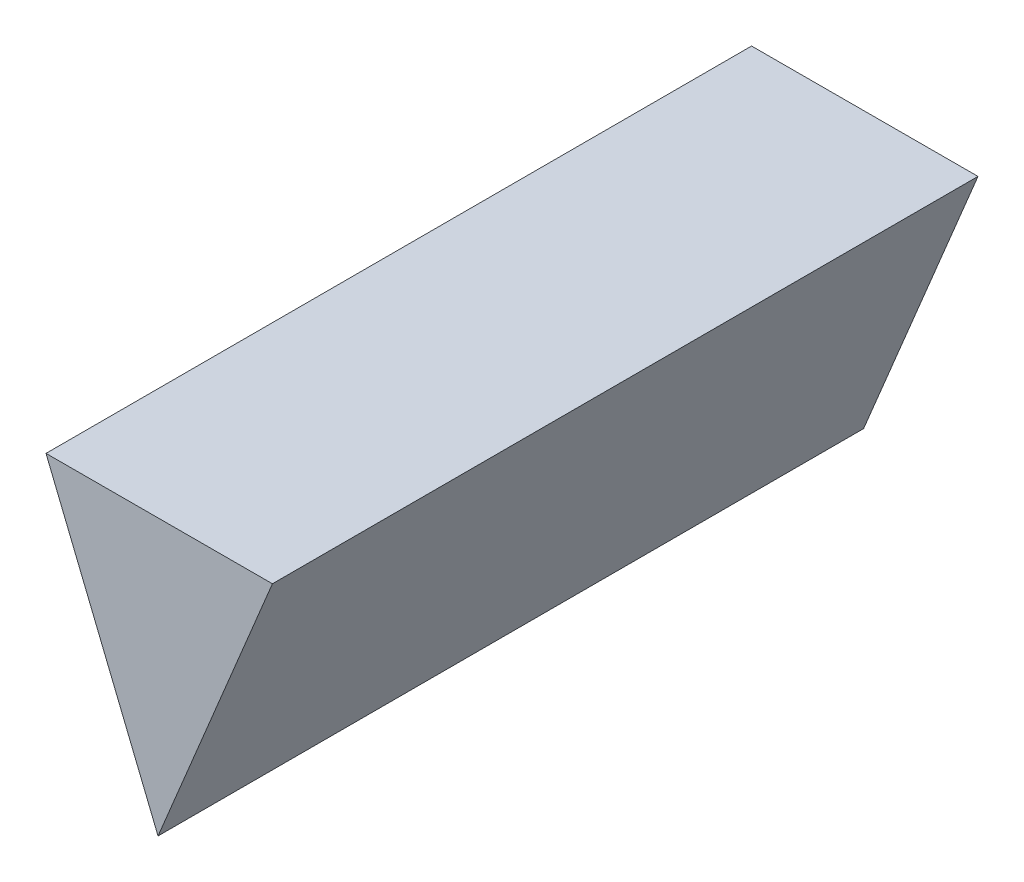
ISO-10303-21;
HEADER;
FILE_DESCRIPTION(('STEP AP214'),'2;1');
FILE_NAME('part.step','',(''),(''),'','','');
FILE_SCHEMA(('AUTOMOTIVE_DESIGN { 1 0 10303 214 1 1 1 1 }'));
ENDSEC;
DATA;
#1=APPLICATION_CONTEXT('core data for automotive mechanical design processes');
#2=APPLICATION_PROTOCOL_DEFINITION('international standard','automotive_design',2000,#1);
#3=PRODUCT_CONTEXT('',#1,'mechanical');
#4=PRODUCT('Part','Part','',(#3));
#5=PRODUCT_RELATED_PRODUCT_CATEGORY('part','',(#4));
#6=PRODUCT_DEFINITION_FORMATION('','',#4);
#7=PRODUCT_DEFINITION_CONTEXT('part definition',#1,'design');
#8=PRODUCT_DEFINITION('design','',#6,#7);
#9=PRODUCT_DEFINITION_SHAPE('','',#8);
#10=(LENGTH_UNIT() NAMED_UNIT(*) SI_UNIT(.MILLI.,.METRE.));
#11=(NAMED_UNIT(*) PLANE_ANGLE_UNIT() SI_UNIT($,.RADIAN.));
#12=(NAMED_UNIT(*) SI_UNIT($,.STERADIAN.) SOLID_ANGLE_UNIT());
#13=UNCERTAINTY_MEASURE_WITH_UNIT(LENGTH_MEASURE(1.E-05),#10,'distance_accuracy_value','');
#14=(GEOMETRIC_REPRESENTATION_CONTEXT(3) GLOBAL_UNCERTAINTY_ASSIGNED_CONTEXT((#13)) GLOBAL_UNIT_ASSIGNED_CONTEXT((#10,
#11,#12)) REPRESENTATION_CONTEXT('',''));
#15=CARTESIAN_POINT('',(0.,0.,0.));
#16=DIRECTION('',(0.,0.,1.));
#17=DIRECTION('',(1.,0.,0.));
#18=AXIS2_PLACEMENT_3D('',#15,#16,#17);
#19=CARTESIAN_POINT('',(6.026927431612,1.349535001279,0.));
#20=DIRECTION('',(-0.001346854373631,0.999999092991237,0.));
#21=DIRECTION('',(-0.999999092991237,-0.001346854373631,0.));
#22=AXIS2_PLACEMENT_3D('',#19,#20,#21);
#23=PLANE('',#22);
#24=DIRECTION('',(-0.999999092991237,-0.001346854373631,0.));
#25=VECTOR('',#24,1.);
#26=CARTESIAN_POINT('',(6.026927431612,1.349535001279,0.));
#27=LINE('',#26,#25);
#28=CARTESIAN_POINT('',(6.026927431612,1.349535001279,0.));
#29=VERTEX_POINT('',#28);
#30=CARTESIAN_POINT('',(5.994833595808,1.349491775517,0.));
#31=VERTEX_POINT('',#30);
#32=EDGE_CURVE('E11',#29,#31,#27,.T.);
#33=ORIENTED_EDGE('',*,*,#32,.T.);
#34=DIRECTION('',(0.,0.,1.));
#35=VECTOR('',#34,1.);
#36=CARTESIAN_POINT('',(5.994833595808,1.349491775517,0.));
#37=LINE('',#36,#35);
#38=CARTESIAN_POINT('',(5.994833595808,1.349491775517,0.1));
#39=VERTEX_POINT('',#38);
#40=EDGE_CURVE('E24',#31,#39,#37,.T.);
#41=ORIENTED_EDGE('',*,*,#40,.T.);
#42=DIRECTION('',(-0.999999092991237,-0.001346854373631,0.));
#43=VECTOR('',#42,1.);
#44=CARTESIAN_POINT('',(6.026927431612,1.349535001279,0.1));
#45=LINE('',#44,#43);
#46=CARTESIAN_POINT('',(6.026927431612,1.349535001279,0.1));
#47=VERTEX_POINT('',#46);
#48=EDGE_CURVE('E67',#47,#39,#45,.T.);
#49=ORIENTED_EDGE('',*,*,#48,.F.);
#50=DIRECTION('',(0.,0.,1.));
#51=VECTOR('',#50,1.);
#52=CARTESIAN_POINT('',(6.026927431612,1.349535001279,0.));
#53=LINE('',#52,#51);
#54=EDGE_CURVE('E54',#29,#47,#53,.T.);
#55=ORIENTED_EDGE('',*,*,#54,.F.);
#56=EDGE_LOOP('',(#33,#41,#49,#55));
#57=FACE_BOUND('',#56,.T.);
#58=ADVANCED_FACE('F17',(#57),#23,.T.);
#59=CARTESIAN_POINT('',(6.010712458003,1.310468500841,0.));
#60=DIRECTION('',(0.923602625971342,-0.383351260985068,0.));
#61=DIRECTION('',(0.383351260985068,0.923602625971342,0.));
#62=AXIS2_PLACEMENT_3D('',#59,#60,#61);
#63=PLANE('',#62);
#64=DIRECTION('',(0.383351260985068,0.923602625971342,0.));
#65=VECTOR('',#64,1.);
#66=CARTESIAN_POINT('',(6.010712458003,1.310468500841,0.));
#67=LINE('',#66,#65);
#68=CARTESIAN_POINT('',(6.010712458003,1.310468500841,0.));
#69=VERTEX_POINT('',#68);
#70=EDGE_CURVE('E58',#69,#29,#67,.T.);
#71=ORIENTED_EDGE('',*,*,#70,.T.);
#72=ORIENTED_EDGE('',*,*,#54,.T.);
#73=DIRECTION('',(0.383351260985068,0.923602625971342,0.));
#74=VECTOR('',#73,1.);
#75=CARTESIAN_POINT('',(6.010712458003,1.310468500841,0.1));
#76=LINE('',#75,#74);
#77=CARTESIAN_POINT('',(6.010712458003,1.310468500841,0.1));
#78=VERTEX_POINT('',#77);
#79=EDGE_CURVE('E48',#78,#47,#76,.T.);
#80=ORIENTED_EDGE('',*,*,#79,.F.);
#81=DIRECTION('',(0.,0.,1.));
#82=VECTOR('',#81,1.);
#83=CARTESIAN_POINT('',(6.010712458003,1.310468500841,0.));
#84=LINE('',#83,#82);
#85=EDGE_CURVE('E52',#69,#78,#84,.T.);
#86=ORIENTED_EDGE('',*,*,#85,.F.);
#87=EDGE_LOOP('',(#71,#72,#80,#86));
#88=FACE_BOUND('',#87,.T.);
#89=ADVANCED_FACE('F51',(#88),#63,.T.);
#90=CARTESIAN_POINT('',(5.994833595808,1.349491775517,0.));
#91=DIRECTION('',(-0.926254074513308,-0.376899707412325,0.));
#92=DIRECTION('',(0.376899707412325,-0.926254074513308,0.));
#93=AXIS2_PLACEMENT_3D('',#90,#91,#92);
#94=PLANE('',#93);
#95=DIRECTION('',(0.376899707412325,-0.926254074513308,0.));
#96=VECTOR('',#95,1.);
#97=CARTESIAN_POINT('',(5.994833595808,1.349491775517,0.));
#98=LINE('',#97,#96);
#99=EDGE_CURVE('E64',#31,#69,#98,.T.);
#100=ORIENTED_EDGE('',*,*,#99,.T.);
#101=ORIENTED_EDGE('',*,*,#85,.T.);
#102=DIRECTION('',(0.376899707412325,-0.926254074513308,0.));
#103=VECTOR('',#102,1.);
#104=CARTESIAN_POINT('',(5.994833595808,1.349491775517,0.1));
#105=LINE('',#104,#103);
#106=EDGE_CURVE('E63',#39,#78,#105,.T.);
#107=ORIENTED_EDGE('',*,*,#106,.F.);
#108=ORIENTED_EDGE('',*,*,#40,.F.);
#109=EDGE_LOOP('',(#100,#101,#107,#108));
#110=FACE_BOUND('',#109,.T.);
#111=ADVANCED_FACE('F62',(#110),#94,.T.);
#112=CARTESIAN_POINT('',(6.010831180517,1.335368061039,0.1));
#113=DIRECTION('',(0.,0.,1.));
#114=DIRECTION('',(1.,0.,0.));
#115=AXIS2_PLACEMENT_3D('',#112,#113,#114);
#116=PLANE('',#115);
#117=ORIENTED_EDGE('',*,*,#106,.T.);
#118=ORIENTED_EDGE('',*,*,#79,.T.);
#119=ORIENTED_EDGE('',*,*,#48,.T.);
#120=EDGE_LOOP('',(#117,#118,#119));
#121=FACE_BOUND('',#120,.T.);
#122=ADVANCED_FACE('F66',(#121),#116,.T.);
#123=CARTESIAN_POINT('',(6.010831180517,1.335368061039,0.));
#124=DIRECTION('',(0.,0.,1.));
#125=DIRECTION('',(1.,0.,0.));
#126=AXIS2_PLACEMENT_3D('',#123,#124,#125);
#127=PLANE('',#126);
#128=ORIENTED_EDGE('',*,*,#99,.F.);
#129=ORIENTED_EDGE('',*,*,#32,.F.);
#130=ORIENTED_EDGE('',*,*,#70,.F.);
#131=EDGE_LOOP('',(#128,#129,#130));
#132=FACE_BOUND('',#131,.T.);
#133=ADVANCED_FACE('F73',(#132),#127,.F.);
#134=CLOSED_SHELL('',(#58,#89,#111,#122,#133));
#135=MANIFOLD_SOLID_BREP('B1',#134);
#136=ADVANCED_BREP_SHAPE_REPRESENTATION('',(#18,#135),#14);
#137=SHAPE_DEFINITION_REPRESENTATION(#9,#136);
ENDSEC;
END-ISO-10303-21;
